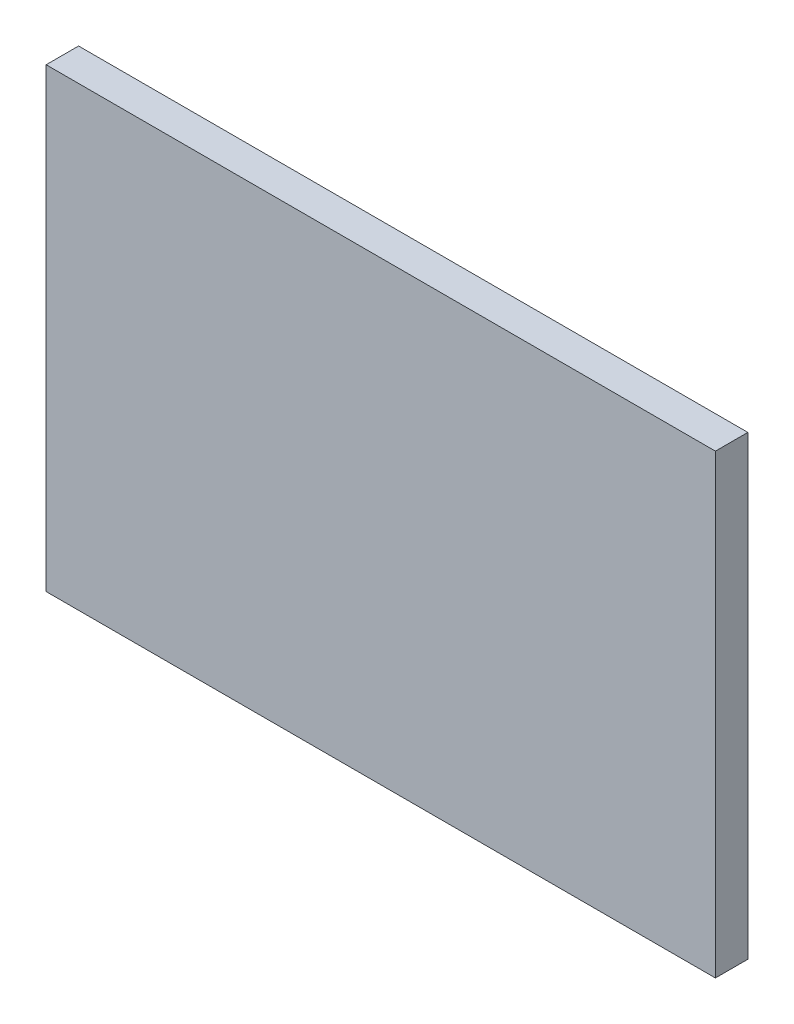
ISO-10303-21;
HEADER;
FILE_DESCRIPTION(('STEP AP214'),'2;1');
FILE_NAME('part.step','',(''),(''),'','','');
FILE_SCHEMA(('AUTOMOTIVE_DESIGN { 1 0 10303 214 1 1 1 1 }'));
ENDSEC;
DATA;
#1=APPLICATION_CONTEXT('core data for automotive mechanical design processes');
#2=APPLICATION_PROTOCOL_DEFINITION('international standard','automotive_design',2000,#1);
#3=PRODUCT_CONTEXT('',#1,'mechanical');
#4=PRODUCT('Part','Part','',(#3));
#5=PRODUCT_RELATED_PRODUCT_CATEGORY('part','',(#4));
#6=PRODUCT_DEFINITION_FORMATION('','',#4);
#7=PRODUCT_DEFINITION_CONTEXT('part definition',#1,'design');
#8=PRODUCT_DEFINITION('design','',#6,#7);
#9=PRODUCT_DEFINITION_SHAPE('','',#8);
#10=(LENGTH_UNIT() NAMED_UNIT(*) SI_UNIT(.MILLI.,.METRE.));
#11=(NAMED_UNIT(*) PLANE_ANGLE_UNIT() SI_UNIT($,.RADIAN.));
#12=(NAMED_UNIT(*) SI_UNIT($,.STERADIAN.) SOLID_ANGLE_UNIT());
#13=UNCERTAINTY_MEASURE_WITH_UNIT(LENGTH_MEASURE(1.E-05),#10,'distance_accuracy_value','');
#14=(GEOMETRIC_REPRESENTATION_CONTEXT(3) GLOBAL_UNCERTAINTY_ASSIGNED_CONTEXT((#13)) GLOBAL_UNIT_ASSIGNED_CONTEXT((#10,
#11,#12)) REPRESENTATION_CONTEXT('',''));
#15=CARTESIAN_POINT('',(0.,0.,0.));
#16=DIRECTION('',(0.,0.,1.));
#17=DIRECTION('',(1.,0.,0.));
#18=AXIS2_PLACEMENT_3D('',#15,#16,#17);
#19=CARTESIAN_POINT('',(15.748,19.558,1.6));
#20=DIRECTION('',(0.,0.,-1.));
#21=DIRECTION('',(0.,-1.,0.));
#22=AXIS2_PLACEMENT_3D('',#19,#20,#21);
#23=PLANE('',#22);
#24=DIRECTION('',(-1.,0.,0.));
#25=VECTOR('',#24,1.);
#26=CARTESIAN_POINT('',(-4.919659,19.558,1.6));
#27=LINE('',#26,#25);
#28=CARTESIAN_POINT('',(15.708,19.558,1.6));
#29=VERTEX_POINT('',#28);
#30=CARTESIAN_POINT('',(-4.919659,19.558,1.6));
#31=VERTEX_POINT('',#30);
#32=EDGE_CURVE('E112',#29,#31,#27,.T.);
#33=ORIENTED_EDGE('',*,*,#32,.F.);
#34=DIRECTION('',(0.,1.,0.));
#35=VECTOR('',#34,1.);
#36=CARTESIAN_POINT('',(15.708,19.558,1.6));
#37=LINE('',#36,#35);
#38=CARTESIAN_POINT('',(15.708,5.4945,1.6));
#39=VERTEX_POINT('',#38);
#40=EDGE_CURVE('E26',#39,#29,#37,.T.);
#41=ORIENTED_EDGE('',*,*,#40,.F.);
#42=DIRECTION('',(1.,0.,0.));
#43=VECTOR('',#42,1.);
#44=CARTESIAN_POINT('',(15.708,5.4945,1.6));
#45=LINE('',#44,#43);
#46=CARTESIAN_POINT('',(-4.919659,5.4945,1.6));
#47=VERTEX_POINT('',#46);
#48=EDGE_CURVE('E20',#47,#39,#45,.T.);
#49=ORIENTED_EDGE('',*,*,#48,.F.);
#50=DIRECTION('',(0.,-1.,0.));
#51=VECTOR('',#50,1.);
#52=CARTESIAN_POINT('',(-4.919659,5.4945,1.6));
#53=LINE('',#52,#51);
#54=EDGE_CURVE('E74',#31,#47,#53,.T.);
#55=ORIENTED_EDGE('',*,*,#54,.F.);
#56=EDGE_LOOP('',(#33,#41,#49,#55));
#57=FACE_BOUND('',#56,.T.);
#58=ADVANCED_FACE('F16',(#57),#23,.T.);
#59=CARTESIAN_POINT('',(15.748,19.558,2.6));
#60=DIRECTION('',(0.,0.,-1.));
#61=DIRECTION('',(0.,-1.,0.));
#62=AXIS2_PLACEMENT_3D('',#59,#60,#61);
#63=PLANE('',#62);
#64=DIRECTION('',(-1.,0.,0.));
#65=VECTOR('',#64,1.);
#66=CARTESIAN_POINT('',(-4.919659,19.558,2.6));
#67=LINE('',#66,#65);
#68=CARTESIAN_POINT('',(15.708,19.558,2.6));
#69=VERTEX_POINT('',#68);
#70=CARTESIAN_POINT('',(-4.919659,19.558,2.6));
#71=VERTEX_POINT('',#70);
#72=EDGE_CURVE('E100',#69,#71,#67,.T.);
#73=ORIENTED_EDGE('',*,*,#72,.T.);
#74=DIRECTION('',(0.,-1.,0.));
#75=VECTOR('',#74,1.);
#76=CARTESIAN_POINT('',(-4.919659,5.4945,2.6));
#77=LINE('',#76,#75);
#78=CARTESIAN_POINT('',(-4.919659,5.4945,2.6));
#79=VERTEX_POINT('',#78);
#80=EDGE_CURVE('E64',#71,#79,#77,.T.);
#81=ORIENTED_EDGE('',*,*,#80,.T.);
#82=DIRECTION('',(1.,0.,0.));
#83=VECTOR('',#82,1.);
#84=CARTESIAN_POINT('',(15.708,5.4945,2.6));
#85=LINE('',#84,#83);
#86=CARTESIAN_POINT('',(15.708,5.4945,2.6));
#87=VERTEX_POINT('',#86);
#88=EDGE_CURVE('E85',#79,#87,#85,.T.);
#89=ORIENTED_EDGE('',*,*,#88,.T.);
#90=DIRECTION('',(0.,1.,0.));
#91=VECTOR('',#90,1.);
#92=CARTESIAN_POINT('',(15.708,19.558,2.6));
#93=LINE('',#92,#91);
#94=EDGE_CURVE('E11',#87,#69,#93,.T.);
#95=ORIENTED_EDGE('',*,*,#94,.T.);
#96=EDGE_LOOP('',(#73,#81,#89,#95));
#97=FACE_BOUND('',#96,.T.);
#98=ADVANCED_FACE('F123',(#97),#63,.F.);
#99=CARTESIAN_POINT('',(15.708,19.558,2.6));
#100=DIRECTION('',(-1.,0.,0.));
#101=DIRECTION('',(0.,0.,1.));
#102=AXIS2_PLACEMENT_3D('',#99,#100,#101);
#103=PLANE('',#102);
#104=ORIENTED_EDGE('',*,*,#40,.T.);
#105=DIRECTION('',(0.,0.,-1.));
#106=VECTOR('',#105,1.);
#107=CARTESIAN_POINT('',(15.708,19.558,2.6));
#108=LINE('',#107,#106);
#109=EDGE_CURVE('E93',#69,#29,#108,.T.);
#110=ORIENTED_EDGE('',*,*,#109,.F.);
#111=ORIENTED_EDGE('',*,*,#94,.F.);
#112=DIRECTION('',(0.,0.,-1.));
#113=VECTOR('',#112,1.);
#114=CARTESIAN_POINT('',(15.708,5.4945,2.6));
#115=LINE('',#114,#113);
#116=EDGE_CURVE('E82',#87,#39,#115,.T.);
#117=ORIENTED_EDGE('',*,*,#116,.T.);
#118=EDGE_LOOP('',(#104,#110,#111,#117));
#119=FACE_BOUND('',#118,.T.);
#120=ADVANCED_FACE('F118',(#119),#103,.F.);
#121=CARTESIAN_POINT('',(15.708,5.4945,2.6));
#122=DIRECTION('',(0.,1.,0.));
#123=DIRECTION('',(1.,0.,0.));
#124=AXIS2_PLACEMENT_3D('',#121,#122,#123);
#125=PLANE('',#124);
#126=ORIENTED_EDGE('',*,*,#48,.T.);
#127=ORIENTED_EDGE('',*,*,#116,.F.);
#128=ORIENTED_EDGE('',*,*,#88,.F.);
#129=DIRECTION('',(0.,0.,-1.));
#130=VECTOR('',#129,1.);
#131=CARTESIAN_POINT('',(-4.919659,5.4945,2.6));
#132=LINE('',#131,#130);
#133=EDGE_CURVE('E83',#79,#47,#132,.T.);
#134=ORIENTED_EDGE('',*,*,#133,.T.);
#135=EDGE_LOOP('',(#126,#127,#128,#134));
#136=FACE_BOUND('',#135,.T.);
#137=ADVANCED_FACE('F84',(#136),#125,.F.);
#138=CARTESIAN_POINT('',(-4.919659,5.4945,2.6));
#139=DIRECTION('',(1.,0.,0.));
#140=DIRECTION('',(0.,-1.,0.));
#141=AXIS2_PLACEMENT_3D('',#138,#139,#140);
#142=PLANE('',#141);
#143=ORIENTED_EDGE('',*,*,#54,.T.);
#144=ORIENTED_EDGE('',*,*,#133,.F.);
#145=ORIENTED_EDGE('',*,*,#80,.F.);
#146=DIRECTION('',(0.,0.,-1.));
#147=VECTOR('',#146,1.);
#148=CARTESIAN_POINT('',(-4.919659,19.558,2.6));
#149=LINE('',#148,#147);
#150=EDGE_CURVE('E90',#71,#31,#149,.T.);
#151=ORIENTED_EDGE('',*,*,#150,.T.);
#152=EDGE_LOOP('',(#143,#144,#145,#151));
#153=FACE_BOUND('',#152,.T.);
#154=ADVANCED_FACE('F88',(#153),#142,.F.);
#155=CARTESIAN_POINT('',(-4.919659,19.558,2.6));
#156=DIRECTION('',(0.,-1.,0.));
#157=DIRECTION('',(-1.,0.,0.));
#158=AXIS2_PLACEMENT_3D('',#155,#156,#157);
#159=PLANE('',#158);
#160=ORIENTED_EDGE('',*,*,#32,.T.);
#161=ORIENTED_EDGE('',*,*,#150,.F.);
#162=ORIENTED_EDGE('',*,*,#72,.F.);
#163=ORIENTED_EDGE('',*,*,#109,.T.);
#164=EDGE_LOOP('',(#160,#161,#162,#163));
#165=FACE_BOUND('',#164,.T.);
#166=ADVANCED_FACE('F18',(#165),#159,.F.);
#167=CLOSED_SHELL('',(#58,#98,#120,#137,#154,#166));
#168=MANIFOLD_SOLID_BREP('B1',#167);
#169=ADVANCED_BREP_SHAPE_REPRESENTATION('',(#18,#168),#14);
#170=SHAPE_DEFINITION_REPRESENTATION(#9,#169);
ENDSEC;
END-ISO-10303-21;
